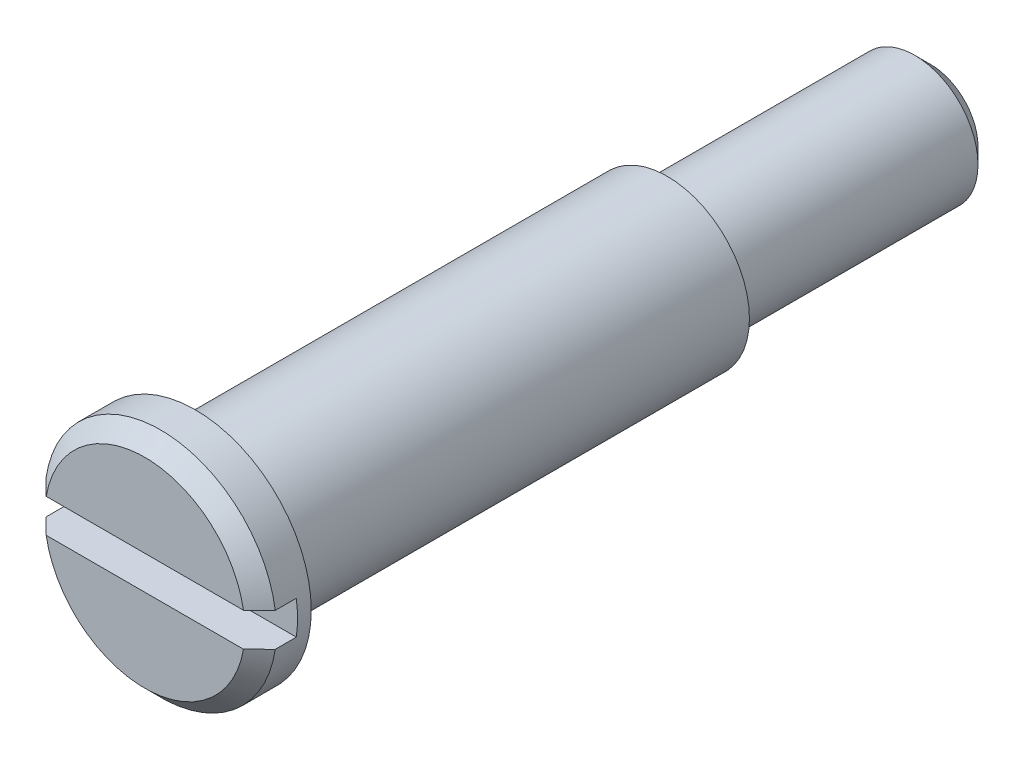
ISO-10303-21;
HEADER;
FILE_DESCRIPTION(('STEP AP214'),'2;1');
FILE_NAME('part.step','',(''),(''),'','','');
FILE_SCHEMA(('AUTOMOTIVE_DESIGN { 1 0 10303 214 1 1 1 1 }'));
ENDSEC;
DATA;
#1=APPLICATION_CONTEXT('core data for automotive mechanical design processes');
#2=APPLICATION_PROTOCOL_DEFINITION('international standard','automotive_design',2000,#1);
#3=PRODUCT_CONTEXT('',#1,'mechanical');
#4=PRODUCT('Part','Part','',(#3));
#5=PRODUCT_RELATED_PRODUCT_CATEGORY('part','',(#4));
#6=PRODUCT_DEFINITION_FORMATION('','',#4);
#7=PRODUCT_DEFINITION_CONTEXT('part definition',#1,'design');
#8=PRODUCT_DEFINITION('design','',#6,#7);
#9=PRODUCT_DEFINITION_SHAPE('','',#8);
#10=(LENGTH_UNIT() NAMED_UNIT(*) SI_UNIT(.MILLI.,.METRE.));
#11=(NAMED_UNIT(*) PLANE_ANGLE_UNIT() SI_UNIT($,.RADIAN.));
#12=(NAMED_UNIT(*) SI_UNIT($,.STERADIAN.) SOLID_ANGLE_UNIT());
#13=UNCERTAINTY_MEASURE_WITH_UNIT(LENGTH_MEASURE(1.E-05),#10,'distance_accuracy_value','');
#14=(GEOMETRIC_REPRESENTATION_CONTEXT(3) GLOBAL_UNCERTAINTY_ASSIGNED_CONTEXT((#13)) GLOBAL_UNIT_ASSIGNED_CONTEXT((#10,
#11,#12)) REPRESENTATION_CONTEXT('',''));
#15=CARTESIAN_POINT('',(0.,0.,0.));
#16=DIRECTION('',(0.,0.,1.));
#17=DIRECTION('',(1.,0.,0.));
#18=AXIS2_PLACEMENT_3D('',#15,#16,#17);
#19=CARTESIAN_POINT('',(0.,0.,2.4));
#20=DIRECTION('',(0.,0.,1.));
#21=DIRECTION('',(1.,0.,0.));
#22=AXIS2_PLACEMENT_3D('',#19,#20,#21);
#23=PLANE('',#22);
#24=DIRECTION('',(-1.,0.,0.));
#25=VECTOR('',#24,1.);
#26=CARTESIAN_POINT('',(0.,0.8,2.4));
#27=LINE('',#26,#25);
#28=CARTESIAN_POINT('',(4.68214694344379,0.8,2.4));
#29=VERTEX_POINT('',#28);
#30=CARTESIAN_POINT('',(-4.68214694344379,0.8,2.4));
#31=VERTEX_POINT('',#30);
#32=EDGE_CURVE('E143',#29,#31,#27,.T.);
#33=ORIENTED_EDGE('',*,*,#32,.F.);
#34=CARTESIAN_POINT('',(0.,0.,2.4));
#35=DIRECTION('',(0.,0.,1.));
#36=DIRECTION('',(1.,0.,0.));
#37=AXIS2_PLACEMENT_3D('',#34,#35,#36);
#38=CIRCLE('',#37,4.75);
#39=EDGE_CURVE('E209',#29,#31,#38,.T.);
#40=ORIENTED_EDGE('',*,*,#39,.T.);
#41=EDGE_LOOP('',(#33,#40));
#42=FACE_BOUND('',#41,.T.);
#43=ADVANCED_FACE('F29',(#42),#23,.T.);
#44=CARTESIAN_POINT('',(0.,0.,-22.4));
#45=DIRECTION('',(0.,0.,1.));
#46=DIRECTION('',(1.,0.,0.));
#47=AXIS2_PLACEMENT_3D('',#44,#45,#46);
#48=PLANE('',#47);
#49=CARTESIAN_POINT('',(0.,0.,-22.4));
#50=DIRECTION('',(0.,0.,1.));
#51=DIRECTION('',(1.,0.,0.));
#52=AXIS2_PLACEMENT_3D('',#49,#50,#51);
#53=CIRCLE('',#52,3.9);
#54=CARTESIAN_POINT('',(3.9,0.,-22.4));
#55=VERTEX_POINT('',#54);
#56=EDGE_CURVE('E129',#55,#55,#53,.T.);
#57=ORIENTED_EDGE('',*,*,#56,.F.);
#58=EDGE_LOOP('',(#57));
#59=FACE_BOUND('',#58,.T.);
#60=CARTESIAN_POINT('',(0.,0.,-22.4));
#61=DIRECTION('',(0.,0.,1.));
#62=DIRECTION('',(1.,0.,0.));
#63=AXIS2_PLACEMENT_3D('',#60,#61,#62);
#64=CIRCLE('',#63,3.);
#65=CARTESIAN_POINT('',(3.,0.,-22.4));
#66=VERTEX_POINT('',#65);
#67=EDGE_CURVE('E132',#66,#66,#64,.F.);
#68=ORIENTED_EDGE('',*,*,#67,.F.);
#69=EDGE_LOOP('',(#68));
#70=FACE_BOUND('',#69,.T.);
#71=ADVANCED_FACE('F189',(#59,#70),#48,.F.);
#72=CARTESIAN_POINT('',(0.,0.,-22.4));
#73=DIRECTION('',(0.,0.,1.));
#74=DIRECTION('',(1.,0.,0.));
#75=AXIS2_PLACEMENT_3D('',#72,#73,#74);
#76=CYLINDRICAL_SURFACE('',#75,3.9);
#77=ORIENTED_EDGE('',*,*,#56,.T.);
#78=EDGE_LOOP('',(#77));
#79=FACE_BOUND('',#78,.T.);
#80=CARTESIAN_POINT('',(0.,0.,0.));
#81=DIRECTION('',(0.,0.,1.));
#82=DIRECTION('',(1.,0.,0.));
#83=AXIS2_PLACEMENT_3D('',#80,#81,#82);
#84=CIRCLE('',#83,3.9);
#85=CARTESIAN_POINT('',(3.9,0.,0.));
#86=VERTEX_POINT('',#85);
#87=EDGE_CURVE('E126',#86,#86,#84,.T.);
#88=ORIENTED_EDGE('',*,*,#87,.F.);
#89=EDGE_LOOP('',(#88));
#90=FACE_BOUND('',#89,.T.);
#91=ADVANCED_FACE('F31',(#79,#90),#76,.T.);
#92=CARTESIAN_POINT('',(0.,0.,-34.9));
#93=DIRECTION('',(0.,0.,1.));
#94=DIRECTION('',(1.,0.,0.));
#95=AXIS2_PLACEMENT_3D('',#92,#93,#94);
#96=CYLINDRICAL_SURFACE('',#95,3.);
#97=CARTESIAN_POINT('',(0.,0.,-34.15));
#98=DIRECTION('',(0.,0.,-1.));
#99=DIRECTION('',(-1.,0.,0.));
#100=AXIS2_PLACEMENT_3D('',#97,#98,#99);
#101=CIRCLE('',#100,3.);
#102=CARTESIAN_POINT('',(3.,0.,-34.15));
#103=VERTEX_POINT('',#102);
#104=EDGE_CURVE('E138',#103,#103,#101,.F.);
#105=ORIENTED_EDGE('',*,*,#104,.T.);
#106=EDGE_LOOP('',(#105));
#107=FACE_BOUND('',#106,.T.);
#108=ORIENTED_EDGE('',*,*,#67,.T.);
#109=EDGE_LOOP('',(#108));
#110=FACE_BOUND('',#109,.T.);
#111=ADVANCED_FACE('F185',(#107,#110),#96,.T.);
#112=CARTESIAN_POINT('',(0.,0.,-34.9));
#113=DIRECTION('',(0.,0.,-1.));
#114=DIRECTION('',(-1.,0.,0.));
#115=AXIS2_PLACEMENT_3D('',#112,#113,#114);
#116=PLANE('',#115);
#117=CARTESIAN_POINT('',(0.,0.,-34.9));
#118=DIRECTION('',(0.,0.,-1.));
#119=DIRECTION('',(-1.,0.,0.));
#120=AXIS2_PLACEMENT_3D('',#117,#118,#119);
#121=CIRCLE('',#120,2.25000000000001);
#122=CARTESIAN_POINT('',(2.25000000000001,0.,-34.9));
#123=VERTEX_POINT('',#122);
#124=EDGE_CURVE('E135',#123,#123,#121,.T.);
#125=ORIENTED_EDGE('',*,*,#124,.T.);
#126=EDGE_LOOP('',(#125));
#127=FACE_BOUND('',#126,.T.);
#128=ADVANCED_FACE('F182',(#127),#116,.T.);
#129=CARTESIAN_POINT('',(0.,0.,2.4));
#130=DIRECTION('',(0.,0.,-1.));
#131=DIRECTION('',(-1.,0.,0.));
#132=AXIS2_PLACEMENT_3D('',#129,#130,#131);
#133=CYLINDRICAL_SURFACE('',#132,5.5);
#134=DIRECTION('',(0.,0.,-1.));
#135=VECTOR('',#134,1.);
#136=CARTESIAN_POINT('',(5.44150714416512,-0.8,2.4));
#137=LINE('',#136,#135);
#138=CARTESIAN_POINT('',(5.44150714416512,-0.8,0.65));
#139=VERTEX_POINT('',#138);
#140=CARTESIAN_POINT('',(5.44150714416512,-0.8,1.65));
#141=VERTEX_POINT('',#140);
#142=EDGE_CURVE('E100',#139,#141,#137,.F.);
#143=ORIENTED_EDGE('',*,*,#142,.T.);
#144=CARTESIAN_POINT('',(0.,0.,1.65));
#145=DIRECTION('',(0.,0.,1.));
#146=DIRECTION('',(1.,0.,0.));
#147=AXIS2_PLACEMENT_3D('',#144,#145,#146);
#148=CIRCLE('',#147,5.5);
#149=CARTESIAN_POINT('',(-5.44150714416512,-0.8,1.65));
#150=VERTEX_POINT('',#149);
#151=EDGE_CURVE('E95',#141,#150,#148,.F.);
#152=ORIENTED_EDGE('',*,*,#151,.T.);
#153=DIRECTION('',(0.,0.,-1.));
#154=VECTOR('',#153,1.);
#155=CARTESIAN_POINT('',(-5.44150714416512,-0.8,2.4));
#156=LINE('',#155,#154);
#157=CARTESIAN_POINT('',(-5.44150714416512,-0.8,0.65));
#158=VERTEX_POINT('',#157);
#159=EDGE_CURVE('E86',#150,#158,#156,.T.);
#160=ORIENTED_EDGE('',*,*,#159,.T.);
#161=CARTESIAN_POINT('',(0.,0.,0.65));
#162=DIRECTION('',(0.,0.,1.));
#163=DIRECTION('',(1.,0.,0.));
#164=AXIS2_PLACEMENT_3D('',#161,#162,#163);
#165=CIRCLE('',#164,5.5);
#166=CARTESIAN_POINT('',(-5.44150714416512,0.8,0.65));
#167=VERTEX_POINT('',#166);
#168=EDGE_CURVE('E92',#167,#158,#165,.T.);
#169=ORIENTED_EDGE('',*,*,#168,.F.);
#170=DIRECTION('',(0.,0.,-1.));
#171=VECTOR('',#170,1.);
#172=CARTESIAN_POINT('',(-5.44150714416512,0.8,2.4));
#173=LINE('',#172,#171);
#174=CARTESIAN_POINT('',(-5.44150714416512,0.8,1.65));
#175=VERTEX_POINT('',#174);
#176=EDGE_CURVE('E99',#167,#175,#173,.F.);
#177=ORIENTED_EDGE('',*,*,#176,.T.);
#178=CARTESIAN_POINT('',(0.,0.,1.65));
#179=DIRECTION('',(0.,0.,1.));
#180=DIRECTION('',(1.,0.,0.));
#181=AXIS2_PLACEMENT_3D('',#178,#179,#180);
#182=CIRCLE('',#181,5.5);
#183=CARTESIAN_POINT('',(5.44150714416512,0.8,1.65));
#184=VERTEX_POINT('',#183);
#185=EDGE_CURVE('E212',#175,#184,#182,.F.);
#186=ORIENTED_EDGE('',*,*,#185,.T.);
#187=DIRECTION('',(0.,0.,-1.));
#188=VECTOR('',#187,1.);
#189=CARTESIAN_POINT('',(5.44150714416512,0.8,2.4));
#190=LINE('',#189,#188);
#191=CARTESIAN_POINT('',(5.44150714416512,0.8,0.65));
#192=VERTEX_POINT('',#191);
#193=EDGE_CURVE('E121',#184,#192,#190,.T.);
#194=ORIENTED_EDGE('',*,*,#193,.T.);
#195=EDGE_CURVE('E112',#139,#192,#165,.T.);
#196=ORIENTED_EDGE('',*,*,#195,.F.);
#197=EDGE_LOOP('',(#143,#152,#160,#169,#177,#186,#194,#196));
#198=FACE_BOUND('',#197,.T.);
#199=CARTESIAN_POINT('',(0.,0.,0.));
#200=DIRECTION('',(0.,0.,1.));
#201=DIRECTION('',(1.,0.,0.));
#202=AXIS2_PLACEMENT_3D('',#199,#200,#201);
#203=CIRCLE('',#202,5.5);
#204=CARTESIAN_POINT('',(5.5,0.,0.));
#205=VERTEX_POINT('',#204);
#206=EDGE_CURVE('E123',#205,#205,#203,.T.);
#207=ORIENTED_EDGE('',*,*,#206,.T.);
#208=EDGE_LOOP('',(#207));
#209=FACE_BOUND('',#208,.T.);
#210=ADVANCED_FACE('F89',(#198,#209),#133,.T.);
#211=DIRECTION('',(1.,0.,0.));
#212=VECTOR('',#211,1.);
#213=CARTESIAN_POINT('',(0.,-0.8,2.4));
#214=LINE('',#213,#212);
#215=CARTESIAN_POINT('',(-4.68214694344379,-0.8,2.4));
#216=VERTEX_POINT('',#215);
#217=CARTESIAN_POINT('',(4.68214694344379,-0.8,2.4));
#218=VERTEX_POINT('',#217);
#219=EDGE_CURVE('E141',#216,#218,#214,.T.);
#220=ORIENTED_EDGE('',*,*,#219,.F.);
#221=CARTESIAN_POINT('',(0.,0.,2.4));
#222=DIRECTION('',(0.,0.,1.));
#223=DIRECTION('',(1.,0.,0.));
#224=AXIS2_PLACEMENT_3D('',#221,#222,#223);
#225=CIRCLE('',#224,4.75);
#226=EDGE_CURVE('E111',#216,#218,#225,.T.);
#227=ORIENTED_EDGE('',*,*,#226,.T.);
#228=EDGE_LOOP('',(#220,#227));
#229=FACE_BOUND('',#228,.T.);
#230=ADVANCED_FACE('F175',(#229),#23,.T.);
#231=CARTESIAN_POINT('',(0.,0.,0.));
#232=DIRECTION('',(0.,0.,1.));
#233=DIRECTION('',(1.,0.,0.));
#234=AXIS2_PLACEMENT_3D('',#231,#232,#233);
#235=PLANE('',#234);
#236=ORIENTED_EDGE('',*,*,#87,.T.);
#237=EDGE_LOOP('',(#236));
#238=FACE_BOUND('',#237,.T.);
#239=ORIENTED_EDGE('',*,*,#206,.F.);
#240=EDGE_LOOP('',(#239));
#241=FACE_BOUND('',#240,.T.);
#242=ADVANCED_FACE('F171',(#238,#241),#235,.F.);
#243=CARTESIAN_POINT('',(0.,0.,-34.9));
#244=DIRECTION('',(0.,0.,1.));
#245=DIRECTION('',(1.,0.,0.));
#246=AXIS2_PLACEMENT_3D('',#243,#244,#245);
#247=CONICAL_SURFACE('',#246,2.25000000000001,0.785398163397449);
#248=CARTESIAN_POINT('',(3.,0.,-34.15));
#249=CARTESIAN_POINT('',(2.9921875,0.,-34.1578125));
#250=CARTESIAN_POINT('',(2.984375,0.,-34.165625));
#251=CARTESIAN_POINT('',(2.96875,0.,-34.18125));
#252=CARTESIAN_POINT('',(2.9609375,0.,-34.1890625));
#253=CARTESIAN_POINT('',(2.9453125,0.,-34.2046875));
#254=CARTESIAN_POINT('',(2.9375,0.,-34.2125));
#255=CARTESIAN_POINT('',(2.921875,0.,-34.228125));
#256=CARTESIAN_POINT('',(2.9140625,0.,-34.2359375));
#257=CARTESIAN_POINT('',(2.8984375,0.,-34.2515625));
#258=CARTESIAN_POINT('',(2.890625,0.,-34.259375));
#259=CARTESIAN_POINT('',(2.87500000000001,0.,-34.275));
#260=CARTESIAN_POINT('',(2.86718750000001,0.,-34.2828125));
#261=CARTESIAN_POINT('',(2.85156250000001,0.,-34.2984375));
#262=CARTESIAN_POINT('',(2.84375,0.,-34.30625));
#263=CARTESIAN_POINT('',(2.828125,0.,-34.321875));
#264=CARTESIAN_POINT('',(2.8203125,0.,-34.3296875));
#265=CARTESIAN_POINT('',(2.80468750000001,0.,-34.3453125));
#266=CARTESIAN_POINT('',(2.79687500000001,0.,-34.353125));
#267=CARTESIAN_POINT('',(2.78125000000001,0.,-34.36875));
#268=CARTESIAN_POINT('',(2.77343750000001,0.,-34.3765625));
#269=CARTESIAN_POINT('',(2.75781250000001,0.,-34.3921875));
#270=CARTESIAN_POINT('',(2.75000000000001,0.,-34.4));
#271=CARTESIAN_POINT('',(2.73437500000001,0.,-34.415625));
#272=CARTESIAN_POINT('',(2.72656250000001,0.,-34.4234375));
#273=CARTESIAN_POINT('',(2.71093750000001,0.,-34.4390625));
#274=CARTESIAN_POINT('',(2.70312500000001,0.,-34.446875));
#275=CARTESIAN_POINT('',(2.68750000000001,0.,-34.4625));
#276=CARTESIAN_POINT('',(2.67968750000001,0.,-34.4703125));
#277=CARTESIAN_POINT('',(2.66406250000001,0.,-34.4859375));
#278=CARTESIAN_POINT('',(2.65625000000001,0.,-34.49375));
#279=CARTESIAN_POINT('',(2.64062500000001,0.,-34.509375));
#280=CARTESIAN_POINT('',(2.63281250000001,0.,-34.5171875));
#281=CARTESIAN_POINT('',(2.61718750000001,0.,-34.5328125));
#282=CARTESIAN_POINT('',(2.60937500000001,0.,-34.540625));
#283=CARTESIAN_POINT('',(2.59375000000001,0.,-34.55625));
#284=CARTESIAN_POINT('',(2.58593750000001,0.,-34.5640625));
#285=CARTESIAN_POINT('',(2.57031250000001,0.,-34.5796875));
#286=CARTESIAN_POINT('',(2.56250000000001,0.,-34.5875));
#287=CARTESIAN_POINT('',(2.54687500000001,0.,-34.603125));
#288=CARTESIAN_POINT('',(2.53906250000001,0.,-34.6109375));
#289=CARTESIAN_POINT('',(2.52343750000001,0.,-34.6265625));
#290=CARTESIAN_POINT('',(2.51562500000001,0.,-34.634375));
#291=CARTESIAN_POINT('',(2.50000000000001,0.,-34.65));
#292=CARTESIAN_POINT('',(2.49218750000001,0.,-34.6578125));
#293=CARTESIAN_POINT('',(2.47656250000001,0.,-34.6734375));
#294=CARTESIAN_POINT('',(2.46875000000001,0.,-34.68125));
#295=CARTESIAN_POINT('',(2.45312500000001,0.,-34.696875));
#296=CARTESIAN_POINT('',(2.44531250000001,0.,-34.7046875));
#297=CARTESIAN_POINT('',(2.42968750000001,0.,-34.7203125));
#298=CARTESIAN_POINT('',(2.42187500000001,0.,-34.728125));
#299=CARTESIAN_POINT('',(2.40625000000001,0.,-34.74375));
#300=CARTESIAN_POINT('',(2.39843750000001,0.,-34.7515625));
#301=CARTESIAN_POINT('',(2.38281250000001,0.,-34.7671875));
#302=CARTESIAN_POINT('',(2.37500000000001,0.,-34.775));
#303=CARTESIAN_POINT('',(2.35937500000001,0.,-34.790625));
#304=CARTESIAN_POINT('',(2.35156250000001,0.,-34.7984375));
#305=CARTESIAN_POINT('',(2.33593750000001,0.,-34.8140625));
#306=CARTESIAN_POINT('',(2.32812500000001,0.,-34.821875));
#307=CARTESIAN_POINT('',(2.31250000000001,0.,-34.8375));
#308=CARTESIAN_POINT('',(2.30468750000001,0.,-34.8453125));
#309=CARTESIAN_POINT('',(2.28906250000001,0.,-34.8609375));
#310=CARTESIAN_POINT('',(2.28125000000001,0.,-34.86875));
#311=CARTESIAN_POINT('',(2.26562500000001,0.,-34.884375));
#312=CARTESIAN_POINT('',(2.25781250000001,0.,-34.8921875));
#313=CARTESIAN_POINT('',(2.25000000000001,0.,-34.9));
#314=B_SPLINE_CURVE_WITH_KNOTS('',3,(#248,#249,#250,#251,#252,#253,#254,#255,#256,#257,#258,
#259,#260,#261,#262,#263,#264,#265,#266,#267,#268,#269,#270,#271,#272,#273,#274,#275,#276,#277,
#278,#279,#280,#281,#282,#283,#284,#285,#286,#287,#288,#289,#290,#291,#292,#293,#294,#295,#296,
#297,#298,#299,#300,#301,#302,#303,#304,#305,#306,#307,#308,#309,#310,#311,#312,#313),
.UNSPECIFIED.,.F.,.F.,(4,2,2,2,2,2,2,2,2,2,2,2,2,2,2,2,2,2,2,2,2,2,2,2,2,2,2,2,2,2,2,2,4),(0.,
0.0331456303681148,0.0662912607362349,0.099436891104355,0.132582521472475,0.165728151840595,
0.198873782208715,0.23201941257683,0.26516504294495,0.298310673313069,0.33145630368119,
0.364601934049309,0.397747564417429,0.430893194785544,0.464038825153664,0.497184455521784,
0.530330085889904,0.563475716258024,0.596621346626144,0.629766976994264,0.662912607362379,
0.696058237730499,0.729203868098619,0.762349498466739,0.795495128834859,0.828640759202979,
0.861786389571094,0.894932019939214,0.928077650307334,0.961223280675453,0.994368911043573,
1.02751454141169,1.06066017177981),.UNSPECIFIED.);
#315=EDGE_CURVE('BSEAM167',#103,#123,#314,.T.);
#316=ORIENTED_EDGE('',*,*,#104,.F.);
#317=ORIENTED_EDGE('',*,*,#124,.F.);
#318=ORIENTED_EDGE('',*,*,#315,.T.);
#319=ORIENTED_EDGE('',*,*,#315,.F.);
#320=EDGE_LOOP('',(#316,#318,#317,#319));
#321=FACE_BOUND('',#320,.T.);
#322=ADVANCED_FACE('F167',(#321),#247,.T.);
#323=CARTESIAN_POINT('',(-5.5,-0.8,0.65));
#324=DIRECTION('',(0.,0.,1.));
#325=DIRECTION('',(1.,0.,0.));
#326=AXIS2_PLACEMENT_3D('',#323,#324,#325);
#327=PLANE('',#326);
#328=DIRECTION('',(-1.,0.,0.));
#329=VECTOR('',#328,1.);
#330=CARTESIAN_POINT('',(-5.5,0.8,0.65));
#331=LINE('',#330,#329);
#332=EDGE_CURVE('E110',#192,#167,#331,.T.);
#333=ORIENTED_EDGE('',*,*,#332,.T.);
#334=ORIENTED_EDGE('',*,*,#168,.T.);
#335=DIRECTION('',(1.,0.,0.));
#336=VECTOR('',#335,1.);
#337=CARTESIAN_POINT('',(-5.5,-0.8,0.65));
#338=LINE('',#337,#336);
#339=EDGE_CURVE('E107',#158,#139,#338,.T.);
#340=ORIENTED_EDGE('',*,*,#339,.T.);
#341=ORIENTED_EDGE('',*,*,#195,.T.);
#342=EDGE_LOOP('',(#333,#334,#340,#341));
#343=FACE_BOUND('',#342,.T.);
#344=ADVANCED_FACE('F105',(#343),#327,.T.);
#345=CARTESIAN_POINT('',(-5.5,0.8,0.65));
#346=DIRECTION('',(0.,1.,0.));
#347=DIRECTION('',(0.,0.,1.));
#348=AXIS2_PLACEMENT_3D('',#345,#346,#347);
#349=PLANE('',#348);
#350=ORIENTED_EDGE('',*,*,#32,.T.);
#351=CARTESIAN_POINT('',(-4.68214694344379,0.8,2.4));
#352=CARTESIAN_POINT('',(-4.8088218311601,0.8,2.27511628376515));
#353=CARTESIAN_POINT('',(-4.93543929272146,0.8,2.15017442468156));
#354=CARTESIAN_POINT('',(-5.18855935962502,0.8,1.90017442467797));
#355=CARTESIAN_POINT('',(-5.31506196497077,0.8,1.77511628376156));
#356=CARTESIAN_POINT('',(-5.44150714416512,0.8,1.65));
#357=B_SPLINE_CURVE_WITH_KNOTS('',3,(#351,#352,#353,#354,#355,#356),.UNSPECIFIED.,.F.,.F.,(4,2,
4),(0.,0.533649742351236,1.06729946821887),.UNSPECIFIED.);
#358=EDGE_CURVE('E11',#31,#175,#357,.T.);
#359=ORIENTED_EDGE('',*,*,#358,.T.);
#360=ORIENTED_EDGE('',*,*,#176,.F.);
#361=ORIENTED_EDGE('',*,*,#332,.F.);
#362=ORIENTED_EDGE('',*,*,#193,.F.);
#363=CARTESIAN_POINT('',(5.44150714416512,0.8,1.65));
#364=CARTESIAN_POINT('',(5.31506196497077,0.8,1.77511628376156));
#365=CARTESIAN_POINT('',(5.18855935962502,0.8,1.90017442467797));
#366=CARTESIAN_POINT('',(4.93543929272146,0.8,2.15017442468156));
#367=CARTESIAN_POINT('',(4.8088218311601,0.8,2.27511628376515));
#368=CARTESIAN_POINT('',(4.68214694344379,0.8,2.4));
#369=B_SPLINE_CURVE_WITH_KNOTS('',3,(#363,#364,#365,#366,#367,#368),.UNSPECIFIED.,.F.,.F.,(4,2,
4),(0.,0.53364972586763,1.06729946821887),.UNSPECIFIED.);
#370=EDGE_CURVE('E42',#184,#29,#369,.T.);
#371=ORIENTED_EDGE('',*,*,#370,.T.);
#372=EDGE_LOOP('',(#350,#359,#360,#361,#362,#371));
#373=FACE_BOUND('',#372,.T.);
#374=ADVANCED_FACE('F165',(#373),#349,.F.);
#375=CARTESIAN_POINT('',(-5.5,-0.8,0.65));
#376=DIRECTION('',(0.,-1.,0.));
#377=DIRECTION('',(0.,0.,-1.));
#378=AXIS2_PLACEMENT_3D('',#375,#376,#377);
#379=PLANE('',#378);
#380=ORIENTED_EDGE('',*,*,#219,.T.);
#381=CARTESIAN_POINT('',(4.68214694344379,-0.8,2.4));
#382=CARTESIAN_POINT('',(4.8088218311601,-0.8,2.27511628376515));
#383=CARTESIAN_POINT('',(4.93543929272146,-0.8,2.15017442468156));
#384=CARTESIAN_POINT('',(5.18855935962502,-0.8,1.90017442467797));
#385=CARTESIAN_POINT('',(5.31506196497077,-0.8,1.77511628376156));
#386=CARTESIAN_POINT('',(5.44150714416512,-0.8,1.65));
#387=B_SPLINE_CURVE_WITH_KNOTS('',3,(#381,#382,#383,#384,#385,#386),.UNSPECIFIED.,.F.,.F.,(4,2,
4),(0.,0.533649742351236,1.06729946821887),.UNSPECIFIED.);
#388=EDGE_CURVE('E154',#218,#141,#387,.T.);
#389=ORIENTED_EDGE('',*,*,#388,.T.);
#390=ORIENTED_EDGE('',*,*,#142,.F.);
#391=ORIENTED_EDGE('',*,*,#339,.F.);
#392=ORIENTED_EDGE('',*,*,#159,.F.);
#393=CARTESIAN_POINT('',(-5.44150714416512,-0.8,1.65));
#394=CARTESIAN_POINT('',(-5.31506196497077,-0.8,1.77511628376156));
#395=CARTESIAN_POINT('',(-5.18855935962502,-0.8,1.90017442467797));
#396=CARTESIAN_POINT('',(-4.93543929272146,-0.8,2.15017442468156));
#397=CARTESIAN_POINT('',(-4.8088218311601,-0.8,2.27511628376515));
#398=CARTESIAN_POINT('',(-4.68214694344379,-0.8,2.4));
#399=B_SPLINE_CURVE_WITH_KNOTS('',3,(#393,#394,#395,#396,#397,#398),.UNSPECIFIED.,.F.,.F.,(4,2,
4),(0.,0.53364972586763,1.06729946821887),.UNSPECIFIED.);
#400=EDGE_CURVE('E147',#150,#216,#399,.T.);
#401=ORIENTED_EDGE('',*,*,#400,.T.);
#402=EDGE_LOOP('',(#380,#389,#390,#391,#392,#401));
#403=FACE_BOUND('',#402,.T.);
#404=ADVANCED_FACE('F115',(#403),#379,.F.);
#405=CARTESIAN_POINT('',(0.,0.,2.4));
#406=DIRECTION('',(0.,0.,-1.));
#407=DIRECTION('',(-1.,0.,0.));
#408=AXIS2_PLACEMENT_3D('',#405,#406,#407);
#409=CONICAL_SURFACE('',#408,4.75,0.785398163397446);
#410=ORIENTED_EDGE('',*,*,#400,.F.);
#411=ORIENTED_EDGE('',*,*,#151,.F.);
#412=ORIENTED_EDGE('',*,*,#388,.F.);
#413=ORIENTED_EDGE('',*,*,#226,.F.);
#414=EDGE_LOOP('',(#410,#411,#412,#413));
#415=FACE_BOUND('',#414,.T.);
#416=ADVANCED_FACE('F159',(#415),#409,.T.);
#417=CARTESIAN_POINT('',(0.,0.,2.4));
#418=DIRECTION('',(0.,0.,-1.));
#419=DIRECTION('',(-1.,0.,0.));
#420=AXIS2_PLACEMENT_3D('',#417,#418,#419);
#421=CONICAL_SURFACE('',#420,4.75,0.785398163397446);
#422=ORIENTED_EDGE('',*,*,#370,.F.);
#423=ORIENTED_EDGE('',*,*,#185,.F.);
#424=ORIENTED_EDGE('',*,*,#358,.F.);
#425=ORIENTED_EDGE('',*,*,#39,.F.);
#426=EDGE_LOOP('',(#422,#423,#424,#425));
#427=FACE_BOUND('',#426,.T.);
#428=ADVANCED_FACE('F210',(#427),#421,.T.);
#429=CLOSED_SHELL('',(#43,#71,#91,#111,#128,#210,#230,#242,#322,#344,#374,#404,#416,#428));
#430=MANIFOLD_SOLID_BREP('B2',#429);
#431=ADVANCED_BREP_SHAPE_REPRESENTATION('',(#18,#430),#14);
#432=SHAPE_DEFINITION_REPRESENTATION(#9,#431);
ENDSEC;
END-ISO-10303-21;
